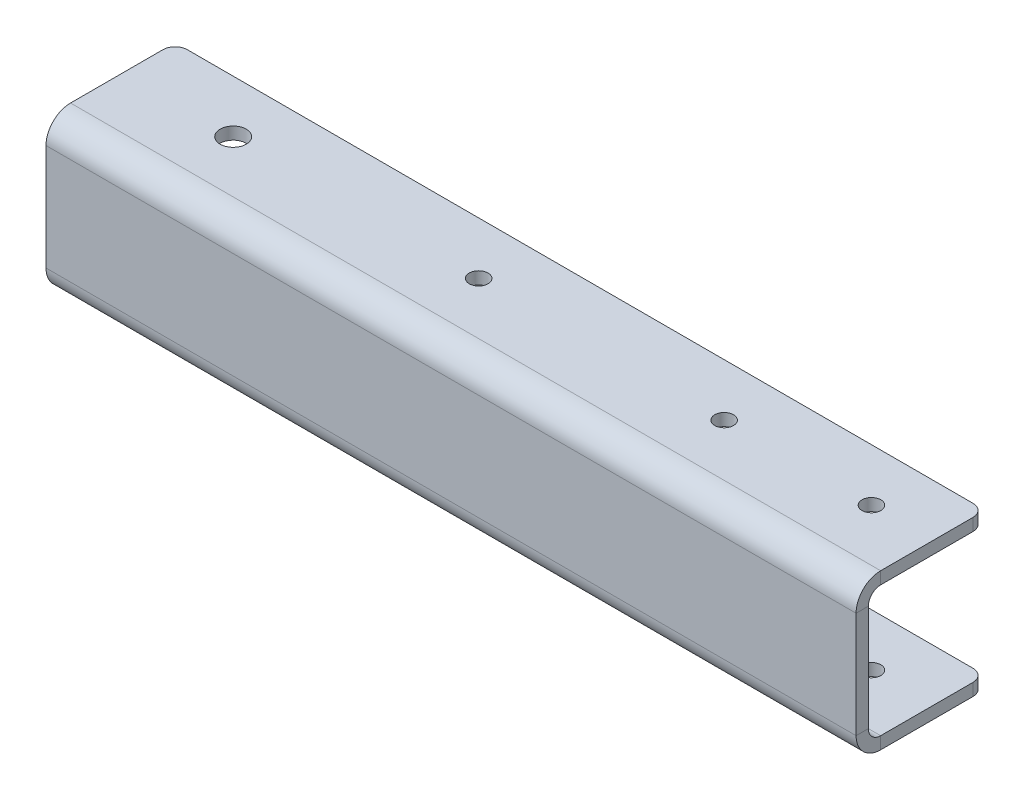
ISO-10303-21;
HEADER;
FILE_DESCRIPTION(('STEP AP214'),'2;1');
FILE_NAME('part.step','',(''),(''),'','','');
FILE_SCHEMA(('AUTOMOTIVE_DESIGN { 1 0 10303 214 1 1 1 1 }'));
ENDSEC;
DATA;
#1=APPLICATION_CONTEXT('core data for automotive mechanical design processes');
#2=APPLICATION_PROTOCOL_DEFINITION('international standard','automotive_design',2000,#1);
#3=PRODUCT_CONTEXT('',#1,'mechanical');
#4=PRODUCT('Part','Part','',(#3));
#5=PRODUCT_RELATED_PRODUCT_CATEGORY('part','',(#4));
#6=PRODUCT_DEFINITION_FORMATION('','',#4);
#7=PRODUCT_DEFINITION_CONTEXT('part definition',#1,'design');
#8=PRODUCT_DEFINITION('design','',#6,#7);
#9=PRODUCT_DEFINITION_SHAPE('','',#8);
#10=(LENGTH_UNIT() NAMED_UNIT(*) SI_UNIT(.MILLI.,.METRE.));
#11=(NAMED_UNIT(*) PLANE_ANGLE_UNIT() SI_UNIT($,.RADIAN.));
#12=(NAMED_UNIT(*) SI_UNIT($,.STERADIAN.) SOLID_ANGLE_UNIT());
#13=UNCERTAINTY_MEASURE_WITH_UNIT(LENGTH_MEASURE(1.E-05),#10,'distance_accuracy_value','');
#14=(GEOMETRIC_REPRESENTATION_CONTEXT(3) GLOBAL_UNCERTAINTY_ASSIGNED_CONTEXT((#13)) GLOBAL_UNIT_ASSIGNED_CONTEXT((#10,
#11,#12)) REPRESENTATION_CONTEXT('',''));
#15=CARTESIAN_POINT('',(0.,0.,0.));
#16=DIRECTION('',(0.,0.,1.));
#17=DIRECTION('',(1.,0.,0.));
#18=AXIS2_PLACEMENT_3D('',#15,#16,#17);
#19=CARTESIAN_POINT('',(209.55,0.,-3.175));
#20=DIRECTION('',(1.,0.,0.));
#21=DIRECTION('',(0.,0.,-1.));
#22=AXIS2_PLACEMENT_3D('',#19,#20,#21);
#23=PLANE('',#22);
#24=DIRECTION('',(0.,-1.,0.));
#25=VECTOR('',#24,1.);
#26=CARTESIAN_POINT('',(209.55,0.,-3.175));
#27=LINE('',#26,#25);
#28=CARTESIAN_POINT('',(209.55,0.,-3.175));
#29=VERTEX_POINT('',#28);
#30=CARTESIAN_POINT('',(209.55,-3.175,-3.175));
#31=VERTEX_POINT('',#30);
#32=EDGE_CURVE('E272',#29,#31,#27,.T.);
#33=ORIENTED_EDGE('',*,*,#32,.F.);
#34=CARTESIAN_POINT('',(209.55,3.175,-3.175));
#35=DIRECTION('',(1.,0.,0.));
#36=DIRECTION('',(0.,0.,-1.));
#37=AXIS2_PLACEMENT_3D('',#34,#35,#36);
#38=CIRCLE('',#37,3.175);
#39=CARTESIAN_POINT('',(209.55,3.175,0.));
#40=VERTEX_POINT('',#39);
#41=EDGE_CURVE('E201',#29,#40,#38,.F.);
#42=ORIENTED_EDGE('',*,*,#41,.T.);
#43=DIRECTION('',(0.,0.,-1.));
#44=VECTOR('',#43,1.);
#45=CARTESIAN_POINT('',(209.55,3.175,3.175));
#46=LINE('',#45,#44);
#47=CARTESIAN_POINT('',(209.55,3.175,3.175));
#48=VERTEX_POINT('',#47);
#49=EDGE_CURVE('E270',#48,#40,#46,.T.);
#50=ORIENTED_EDGE('',*,*,#49,.F.);
#51=CARTESIAN_POINT('',(209.55,3.175,-3.175));
#52=DIRECTION('',(1.,0.,0.));
#53=DIRECTION('',(0.,0.,-1.));
#54=AXIS2_PLACEMENT_3D('',#51,#52,#53);
#55=CIRCLE('',#54,6.35);
#56=EDGE_CURVE('E191',#31,#48,#55,.F.);
#57=ORIENTED_EDGE('',*,*,#56,.F.);
#58=EDGE_LOOP('',(#33,#42,#50,#57));
#59=FACE_BOUND('',#58,.T.);
#60=ADVANCED_FACE('F36',(#59),#23,.T.);
#61=CARTESIAN_POINT('',(209.55,3.175,3.175));
#62=DIRECTION('',(1.,0.,0.));
#63=DIRECTION('',(0.,0.,-1.));
#64=AXIS2_PLACEMENT_3D('',#61,#62,#63);
#65=PLANE('',#64);
#66=DIRECTION('',(0.,0.,-1.));
#67=VECTOR('',#66,1.);
#68=CARTESIAN_POINT('',(209.55,-3.175,0.));
#69=LINE('',#68,#67);
#70=CARTESIAN_POINT('',(209.55,-3.175,-27.051));
#71=VERTEX_POINT('',#70);
#72=EDGE_CURVE('E197',#71,#31,#69,.F.);
#73=ORIENTED_EDGE('',*,*,#72,.F.);
#74=DIRECTION('',(0.,-1.,0.));
#75=VECTOR('',#74,1.);
#76=CARTESIAN_POINT('',(209.55,3.175,-27.051));
#77=LINE('',#76,#75);
#78=CARTESIAN_POINT('',(209.55,0.,-27.051));
#79=VERTEX_POINT('',#78);
#80=EDGE_CURVE('E44',#71,#79,#77,.F.);
#81=ORIENTED_EDGE('',*,*,#80,.T.);
#82=DIRECTION('',(0.,0.,1.));
#83=VECTOR('',#82,1.);
#84=CARTESIAN_POINT('',(209.55,0.,0.));
#85=LINE('',#84,#83);
#86=EDGE_CURVE('E199',#79,#29,#85,.T.);
#87=ORIENTED_EDGE('',*,*,#86,.T.);
#88=ORIENTED_EDGE('',*,*,#32,.T.);
#89=EDGE_LOOP('',(#73,#81,#87,#88));
#90=FACE_BOUND('',#89,.T.);
#91=ADVANCED_FACE('F341',(#90),#65,.T.);
#92=CARTESIAN_POINT('',(0.,3.175,0.));
#93=DIRECTION('',(-1.,0.,0.));
#94=DIRECTION('',(0.,0.,1.));
#95=AXIS2_PLACEMENT_3D('',#92,#93,#94);
#96=PLANE('',#95);
#97=DIRECTION('',(0.,0.,1.));
#98=VECTOR('',#97,1.);
#99=CARTESIAN_POINT('',(0.,3.175,0.));
#100=LINE('',#99,#98);
#101=CARTESIAN_POINT('',(0.,3.175,0.));
#102=VERTEX_POINT('',#101);
#103=CARTESIAN_POINT('',(0.,3.175,3.175));
#104=VERTEX_POINT('',#103);
#105=EDGE_CURVE('E268',#102,#104,#100,.T.);
#106=ORIENTED_EDGE('',*,*,#105,.F.);
#107=CARTESIAN_POINT('',(0.,3.175,-3.175));
#108=DIRECTION('',(1.,0.,0.));
#109=DIRECTION('',(0.,0.,-1.));
#110=AXIS2_PLACEMENT_3D('',#107,#108,#109);
#111=CIRCLE('',#110,3.175);
#112=CARTESIAN_POINT('',(0.,0.,-3.175));
#113=VERTEX_POINT('',#112);
#114=EDGE_CURVE('E226',#113,#102,#111,.F.);
#115=ORIENTED_EDGE('',*,*,#114,.F.);
#116=DIRECTION('',(0.,1.,0.));
#117=VECTOR('',#116,1.);
#118=CARTESIAN_POINT('',(0.,-3.175,-3.175));
#119=LINE('',#118,#117);
#120=CARTESIAN_POINT('',(0.,-3.175,-3.175));
#121=VERTEX_POINT('',#120);
#122=EDGE_CURVE('E265',#121,#113,#119,.T.);
#123=ORIENTED_EDGE('',*,*,#122,.F.);
#124=CARTESIAN_POINT('',(0.,3.175,-3.175));
#125=DIRECTION('',(1.,0.,0.));
#126=DIRECTION('',(0.,0.,-1.));
#127=AXIS2_PLACEMENT_3D('',#124,#125,#126);
#128=CIRCLE('',#127,6.35);
#129=EDGE_CURVE('E219',#121,#104,#128,.F.);
#130=ORIENTED_EDGE('',*,*,#129,.T.);
#131=EDGE_LOOP('',(#106,#115,#123,#130));
#132=FACE_BOUND('',#131,.T.);
#133=ADVANCED_FACE('F447',(#132),#96,.T.);
#134=CARTESIAN_POINT('',(0.,-3.175,-3.175));
#135=DIRECTION('',(-1.,0.,0.));
#136=DIRECTION('',(0.,0.,1.));
#137=AXIS2_PLACEMENT_3D('',#134,#135,#136);
#138=PLANE('',#137);
#139=DIRECTION('',(0.,1.,0.));
#140=VECTOR('',#139,1.);
#141=CARTESIAN_POINT('',(0.,0.,0.));
#142=LINE('',#141,#140);
#143=CARTESIAN_POINT('',(0.,30.607,0.));
#144=VERTEX_POINT('',#143);
#145=EDGE_CURVE('E229',#102,#144,#142,.T.);
#146=ORIENTED_EDGE('',*,*,#145,.F.);
#147=ORIENTED_EDGE('',*,*,#105,.T.);
#148=DIRECTION('',(0.,1.,0.));
#149=VECTOR('',#148,1.);
#150=CARTESIAN_POINT('',(0.,0.,3.175));
#151=LINE('',#150,#149);
#152=CARTESIAN_POINT('',(0.,30.607,3.175));
#153=VERTEX_POINT('',#152);
#154=EDGE_CURVE('E216',#104,#153,#151,.T.);
#155=ORIENTED_EDGE('',*,*,#154,.T.);
#156=DIRECTION('',(0.,0.,-1.));
#157=VECTOR('',#156,1.);
#158=CARTESIAN_POINT('',(0.,30.607,3.175));
#159=LINE('',#158,#157);
#160=EDGE_CURVE('E261',#153,#144,#159,.T.);
#161=ORIENTED_EDGE('',*,*,#160,.T.);
#162=EDGE_LOOP('',(#146,#147,#155,#161));
#163=FACE_BOUND('',#162,.T.);
#164=ADVANCED_FACE('F475',(#163),#138,.T.);
#165=CARTESIAN_POINT('',(209.55,30.607,0.));
#166=DIRECTION('',(1.,0.,0.));
#167=DIRECTION('',(0.,0.,-1.));
#168=AXIS2_PLACEMENT_3D('',#165,#166,#167);
#169=PLANE('',#168);
#170=DIRECTION('',(0.,0.,1.));
#171=VECTOR('',#170,1.);
#172=CARTESIAN_POINT('',(209.55,30.607,0.));
#173=LINE('',#172,#171);
#174=CARTESIAN_POINT('',(209.55,30.607,0.));
#175=VERTEX_POINT('',#174);
#176=CARTESIAN_POINT('',(209.55,30.607,3.175));
#177=VERTEX_POINT('',#176);
#178=EDGE_CURVE('E162',#175,#177,#173,.T.);
#179=ORIENTED_EDGE('',*,*,#178,.F.);
#180=CARTESIAN_POINT('',(209.55,30.607,-3.175));
#181=DIRECTION('',(1.,0.,0.));
#182=DIRECTION('',(0.,0.,-1.));
#183=AXIS2_PLACEMENT_3D('',#180,#181,#182);
#184=CIRCLE('',#183,3.175);
#185=CARTESIAN_POINT('',(209.55,33.782,-3.175));
#186=VERTEX_POINT('',#185);
#187=EDGE_CURVE('E157',#175,#186,#184,.F.);
#188=ORIENTED_EDGE('',*,*,#187,.T.);
#189=DIRECTION('',(0.,-1.,0.));
#190=VECTOR('',#189,1.);
#191=CARTESIAN_POINT('',(209.55,36.957,-3.175));
#192=LINE('',#191,#190);
#193=CARTESIAN_POINT('',(209.55,36.957,-3.175));
#194=VERTEX_POINT('',#193);
#195=EDGE_CURVE('E150',#194,#186,#192,.T.);
#196=ORIENTED_EDGE('',*,*,#195,.F.);
#197=CARTESIAN_POINT('',(209.55,30.607,-3.175));
#198=DIRECTION('',(1.,0.,0.));
#199=DIRECTION('',(0.,0.,-1.));
#200=AXIS2_PLACEMENT_3D('',#197,#198,#199);
#201=CIRCLE('',#200,6.35);
#202=EDGE_CURVE('E154',#177,#194,#201,.F.);
#203=ORIENTED_EDGE('',*,*,#202,.F.);
#204=EDGE_LOOP('',(#179,#188,#196,#203));
#205=FACE_BOUND('',#204,.T.);
#206=ADVANCED_FACE('F152',(#205),#169,.T.);
#207=CARTESIAN_POINT('',(209.55,36.957,-3.175));
#208=DIRECTION('',(1.,0.,0.));
#209=DIRECTION('',(0.,0.,-1.));
#210=AXIS2_PLACEMENT_3D('',#207,#208,#209);
#211=PLANE('',#210);
#212=DIRECTION('',(0.,1.,0.));
#213=VECTOR('',#212,1.);
#214=CARTESIAN_POINT('',(209.55,0.,0.));
#215=LINE('',#214,#213);
#216=EDGE_CURVE('E204',#40,#175,#215,.T.);
#217=ORIENTED_EDGE('',*,*,#216,.T.);
#218=ORIENTED_EDGE('',*,*,#178,.T.);
#219=DIRECTION('',(0.,1.,0.));
#220=VECTOR('',#219,1.);
#221=CARTESIAN_POINT('',(209.55,0.,3.175));
#222=LINE('',#221,#220);
#223=EDGE_CURVE('E189',#48,#177,#222,.T.);
#224=ORIENTED_EDGE('',*,*,#223,.F.);
#225=ORIENTED_EDGE('',*,*,#49,.T.);
#226=EDGE_LOOP('',(#217,#218,#224,#225));
#227=FACE_BOUND('',#226,.T.);
#228=ADVANCED_FACE('F357',(#227),#211,.T.);
#229=CARTESIAN_POINT('',(0.,33.782,-3.175));
#230=DIRECTION('',(-1.,0.,0.));
#231=DIRECTION('',(0.,0.,1.));
#232=AXIS2_PLACEMENT_3D('',#229,#230,#231);
#233=PLANE('',#232);
#234=DIRECTION('',(0.,1.,0.));
#235=VECTOR('',#234,1.);
#236=CARTESIAN_POINT('',(0.,33.782,-3.175));
#237=LINE('',#236,#235);
#238=CARTESIAN_POINT('',(0.,33.782,-3.175));
#239=VERTEX_POINT('',#238);
#240=CARTESIAN_POINT('',(0.,36.957,-3.175));
#241=VERTEX_POINT('',#240);
#242=EDGE_CURVE('E163',#239,#241,#237,.T.);
#243=ORIENTED_EDGE('',*,*,#242,.F.);
#244=CARTESIAN_POINT('',(0.,30.607,-3.175));
#245=DIRECTION('',(1.,0.,0.));
#246=DIRECTION('',(0.,0.,-1.));
#247=AXIS2_PLACEMENT_3D('',#244,#245,#246);
#248=CIRCLE('',#247,3.175);
#249=EDGE_CURVE('E232',#144,#239,#248,.F.);
#250=ORIENTED_EDGE('',*,*,#249,.F.);
#251=ORIENTED_EDGE('',*,*,#160,.F.);
#252=CARTESIAN_POINT('',(0.,30.607,-3.175));
#253=DIRECTION('',(1.,0.,0.));
#254=DIRECTION('',(0.,0.,-1.));
#255=AXIS2_PLACEMENT_3D('',#252,#253,#254);
#256=CIRCLE('',#255,6.35);
#257=EDGE_CURVE('E214',#153,#241,#256,.F.);
#258=ORIENTED_EDGE('',*,*,#257,.T.);
#259=EDGE_LOOP('',(#243,#250,#251,#258));
#260=FACE_BOUND('',#259,.T.);
#261=ADVANCED_FACE('F473',(#260),#233,.T.);
#262=CARTESIAN_POINT('',(0.,30.607,3.175));
#263=DIRECTION('',(-1.,0.,0.));
#264=DIRECTION('',(0.,0.,1.));
#265=AXIS2_PLACEMENT_3D('',#262,#263,#264);
#266=PLANE('',#265);
#267=DIRECTION('',(0.,0.,-1.));
#268=VECTOR('',#267,1.);
#269=CARTESIAN_POINT('',(0.,36.957,0.));
#270=LINE('',#269,#268);
#271=CARTESIAN_POINT('',(0.,36.957,-27.051));
#272=VERTEX_POINT('',#271);
#273=EDGE_CURVE('E175',#241,#272,#270,.T.);
#274=ORIENTED_EDGE('',*,*,#273,.T.);
#275=DIRECTION('',(0.,-1.,0.));
#276=VECTOR('',#275,1.);
#277=CARTESIAN_POINT('',(0.,30.607,-27.051));
#278=LINE('',#277,#276);
#279=CARTESIAN_POINT('',(0.,33.782,-27.051));
#280=VERTEX_POINT('',#279);
#281=EDGE_CURVE('E275',#272,#280,#278,.T.);
#282=ORIENTED_EDGE('',*,*,#281,.T.);
#283=DIRECTION('',(0.,0.,-1.));
#284=VECTOR('',#283,1.);
#285=CARTESIAN_POINT('',(0.,33.782,0.));
#286=LINE('',#285,#284);
#287=EDGE_CURVE('E209',#239,#280,#286,.T.);
#288=ORIENTED_EDGE('',*,*,#287,.F.);
#289=ORIENTED_EDGE('',*,*,#242,.T.);
#290=EDGE_LOOP('',(#274,#282,#288,#289));
#291=FACE_BOUND('',#290,.T.);
#292=ADVANCED_FACE('F471',(#291),#266,.T.);
#293=CARTESIAN_POINT('',(209.55,33.782,0.));
#294=DIRECTION('',(0.,1.,0.));
#295=DIRECTION('',(0.,0.,1.));
#296=AXIS2_PLACEMENT_3D('',#293,#294,#295);
#297=PLANE('',#296);
#298=CARTESIAN_POINT('',(28.575,33.782,-16.66875));
#299=DIRECTION('',(0.,1.,0.));
#300=DIRECTION('',(0.,0.,1.));
#301=AXIS2_PLACEMENT_3D('',#298,#299,#300);
#302=CIRCLE('',#301,3.3782);
#303=CARTESIAN_POINT('',(28.575,33.782,-13.29055));
#304=VERTEX_POINT('',#303);
#305=EDGE_CURVE('E212',#304,#304,#302,.T.);
#306=ORIENTED_EDGE('',*,*,#305,.T.);
#307=EDGE_LOOP('',(#306));
#308=FACE_BOUND('',#307,.T.);
#309=CARTESIAN_POINT('',(92.075,33.782,-16.66875));
#310=DIRECTION('',(0.,1.,0.));
#311=DIRECTION('',(0.,0.,1.));
#312=AXIS2_PLACEMENT_3D('',#309,#310,#311);
#313=CIRCLE('',#312,2.4257);
#314=CARTESIAN_POINT('',(92.075,33.782,-14.24305));
#315=VERTEX_POINT('',#314);
#316=EDGE_CURVE('E288',#315,#315,#313,.T.);
#317=ORIENTED_EDGE('',*,*,#316,.T.);
#318=EDGE_LOOP('',(#317));
#319=FACE_BOUND('',#318,.T.);
#320=CARTESIAN_POINT('',(155.575,33.782,-16.66875));
#321=DIRECTION('',(0.,1.,0.));
#322=DIRECTION('',(0.,0.,1.));
#323=AXIS2_PLACEMENT_3D('',#320,#321,#322);
#324=CIRCLE('',#323,2.4257);
#325=CARTESIAN_POINT('',(155.575,33.782,-14.24305));
#326=VERTEX_POINT('',#325);
#327=EDGE_CURVE('E284',#326,#326,#324,.T.);
#328=ORIENTED_EDGE('',*,*,#327,.T.);
#329=EDGE_LOOP('',(#328));
#330=FACE_BOUND('',#329,.T.);
#331=CARTESIAN_POINT('',(193.675,33.782,-16.66875));
#332=DIRECTION('',(0.,1.,0.));
#333=DIRECTION('',(0.,0.,1.));
#334=AXIS2_PLACEMENT_3D('',#331,#332,#333);
#335=CIRCLE('',#334,2.4257);
#336=CARTESIAN_POINT('',(193.675,33.782,-14.24305));
#337=VERTEX_POINT('',#336);
#338=EDGE_CURVE('E279',#337,#337,#335,.T.);
#339=ORIENTED_EDGE('',*,*,#338,.T.);
#340=EDGE_LOOP('',(#339));
#341=FACE_BOUND('',#340,.T.);
#342=ORIENTED_EDGE('',*,*,#287,.T.);
#343=CARTESIAN_POINT('',(3.175,33.782,-27.051));
#344=DIRECTION('',(0.,1.,0.));
#345=DIRECTION('',(0.,0.,1.));
#346=AXIS2_PLACEMENT_3D('',#343,#344,#345);
#347=CIRCLE('',#346,3.175);
#348=CARTESIAN_POINT('',(3.17500000000001,33.782,-30.226));
#349=VERTEX_POINT('',#348);
#350=EDGE_CURVE('E296',#280,#349,#347,.F.);
#351=ORIENTED_EDGE('',*,*,#350,.T.);
#352=DIRECTION('',(-1.,0.,0.));
#353=VECTOR('',#352,1.);
#354=CARTESIAN_POINT('',(209.55,33.782,-30.226));
#355=LINE('',#354,#353);
#356=CARTESIAN_POINT('',(206.375,33.782,-30.226));
#357=VERTEX_POINT('',#356);
#358=EDGE_CURVE('E258',#357,#349,#355,.T.);
#359=ORIENTED_EDGE('',*,*,#358,.F.);
#360=CARTESIAN_POINT('',(206.375,33.782,-27.051));
#361=DIRECTION('',(0.,1.,0.));
#362=DIRECTION('',(0.,0.,1.));
#363=AXIS2_PLACEMENT_3D('',#360,#361,#362);
#364=CIRCLE('',#363,3.175);
#365=CARTESIAN_POINT('',(209.55,33.782,-27.051));
#366=VERTEX_POINT('',#365);
#367=EDGE_CURVE('E294',#357,#366,#364,.F.);
#368=ORIENTED_EDGE('',*,*,#367,.T.);
#369=DIRECTION('',(0.,0.,-1.));
#370=VECTOR('',#369,1.);
#371=CARTESIAN_POINT('',(209.55,33.782,0.));
#372=LINE('',#371,#370);
#373=EDGE_CURVE('E184',#186,#366,#372,.T.);
#374=ORIENTED_EDGE('',*,*,#373,.F.);
#375=DIRECTION('',(-1.,0.,0.));
#376=VECTOR('',#375,1.);
#377=CARTESIAN_POINT('',(209.55,33.782,-3.175));
#378=LINE('',#377,#376);
#379=EDGE_CURVE('E208',#186,#239,#378,.T.);
#380=ORIENTED_EDGE('',*,*,#379,.T.);
#381=EDGE_LOOP('',(#342,#351,#359,#368,#374,#380));
#382=FACE_BOUND('',#381,.T.);
#383=ADVANCED_FACE('F369',(#308,#319,#330,#341,#382),#297,.F.);
#384=CARTESIAN_POINT('',(209.55,36.957,-30.226));
#385=DIRECTION('',(0.,0.,-1.));
#386=DIRECTION('',(-1.,0.,0.));
#387=AXIS2_PLACEMENT_3D('',#384,#385,#386);
#388=PLANE('',#387);
#389=ORIENTED_EDGE('',*,*,#358,.T.);
#390=DIRECTION('',(0.,-1.,0.));
#391=VECTOR('',#390,1.);
#392=CARTESIAN_POINT('',(3.17500000000001,36.957,-30.226));
#393=LINE('',#392,#391);
#394=CARTESIAN_POINT('',(3.17500000000001,36.957,-30.226));
#395=VERTEX_POINT('',#394);
#396=EDGE_CURVE('E301',#349,#395,#393,.F.);
#397=ORIENTED_EDGE('',*,*,#396,.T.);
#398=DIRECTION('',(-1.,0.,0.));
#399=VECTOR('',#398,1.);
#400=CARTESIAN_POINT('',(209.55,36.957,-30.226));
#401=LINE('',#400,#399);
#402=CARTESIAN_POINT('',(206.375,36.957,-30.226));
#403=VERTEX_POINT('',#402);
#404=EDGE_CURVE('E179',#403,#395,#401,.T.);
#405=ORIENTED_EDGE('',*,*,#404,.F.);
#406=DIRECTION('',(0.,-1.,0.));
#407=VECTOR('',#406,1.);
#408=CARTESIAN_POINT('',(206.375,36.957,-30.226));
#409=LINE('',#408,#407);
#410=EDGE_CURVE('E298',#403,#357,#409,.T.);
#411=ORIENTED_EDGE('',*,*,#410,.T.);
#412=EDGE_LOOP('',(#389,#397,#405,#411));
#413=FACE_BOUND('',#412,.T.);
#414=ADVANCED_FACE('F467',(#413),#388,.T.);
#415=CARTESIAN_POINT('',(209.55,36.957,0.));
#416=DIRECTION('',(0.,1.,0.));
#417=DIRECTION('',(0.,0.,1.));
#418=AXIS2_PLACEMENT_3D('',#415,#416,#417);
#419=PLANE('',#418);
#420=CARTESIAN_POINT('',(28.575,36.957,-16.66875));
#421=DIRECTION('',(0.,1.,0.));
#422=DIRECTION('',(0.,0.,1.));
#423=AXIS2_PLACEMENT_3D('',#420,#421,#422);
#424=CIRCLE('',#423,3.3782);
#425=CARTESIAN_POINT('',(28.575,36.957,-13.29055));
#426=VERTEX_POINT('',#425);
#427=EDGE_CURVE('E398',#426,#426,#424,.T.);
#428=ORIENTED_EDGE('',*,*,#427,.F.);
#429=EDGE_LOOP('',(#428));
#430=FACE_BOUND('',#429,.T.);
#431=CARTESIAN_POINT('',(92.075,36.957,-16.66875));
#432=DIRECTION('',(0.,1.,0.));
#433=DIRECTION('',(0.,0.,1.));
#434=AXIS2_PLACEMENT_3D('',#431,#432,#433);
#435=CIRCLE('',#434,2.4257);
#436=CARTESIAN_POINT('',(92.075,36.957,-14.24305));
#437=VERTEX_POINT('',#436);
#438=EDGE_CURVE('E392',#437,#437,#435,.T.);
#439=ORIENTED_EDGE('',*,*,#438,.F.);
#440=EDGE_LOOP('',(#439));
#441=FACE_BOUND('',#440,.T.);
#442=CARTESIAN_POINT('',(155.575,36.957,-16.66875));
#443=DIRECTION('',(0.,1.,0.));
#444=DIRECTION('',(0.,0.,1.));
#445=AXIS2_PLACEMENT_3D('',#442,#443,#444);
#446=CIRCLE('',#445,2.4257);
#447=CARTESIAN_POINT('',(155.575,36.957,-14.24305));
#448=VERTEX_POINT('',#447);
#449=EDGE_CURVE('E386',#448,#448,#446,.T.);
#450=ORIENTED_EDGE('',*,*,#449,.F.);
#451=EDGE_LOOP('',(#450));
#452=FACE_BOUND('',#451,.T.);
#453=CARTESIAN_POINT('',(193.675,36.957,-16.66875));
#454=DIRECTION('',(0.,1.,0.));
#455=DIRECTION('',(0.,0.,1.));
#456=AXIS2_PLACEMENT_3D('',#453,#454,#455);
#457=CIRCLE('',#456,2.4257);
#458=CARTESIAN_POINT('',(193.675,36.957,-14.24305));
#459=VERTEX_POINT('',#458);
#460=EDGE_CURVE('E380',#459,#459,#457,.T.);
#461=ORIENTED_EDGE('',*,*,#460,.F.);
#462=EDGE_LOOP('',(#461));
#463=FACE_BOUND('',#462,.T.);
#464=ORIENTED_EDGE('',*,*,#404,.T.);
#465=CARTESIAN_POINT('',(3.175,36.957,-27.051));
#466=DIRECTION('',(0.,1.,0.));
#467=DIRECTION('',(0.,0.,1.));
#468=AXIS2_PLACEMENT_3D('',#465,#466,#467);
#469=CIRCLE('',#468,3.175);
#470=EDGE_CURVE('E305',#395,#272,#469,.T.);
#471=ORIENTED_EDGE('',*,*,#470,.T.);
#472=ORIENTED_EDGE('',*,*,#273,.F.);
#473=DIRECTION('',(-1.,0.,0.));
#474=VECTOR('',#473,1.);
#475=CARTESIAN_POINT('',(209.55,36.957,-3.175));
#476=LINE('',#475,#474);
#477=EDGE_CURVE('E169',#194,#241,#476,.T.);
#478=ORIENTED_EDGE('',*,*,#477,.F.);
#479=DIRECTION('',(0.,0.,-1.));
#480=VECTOR('',#479,1.);
#481=CARTESIAN_POINT('',(209.55,36.957,0.));
#482=LINE('',#481,#480);
#483=CARTESIAN_POINT('',(209.55,36.957,-27.051));
#484=VERTEX_POINT('',#483);
#485=EDGE_CURVE('E172',#194,#484,#482,.T.);
#486=ORIENTED_EDGE('',*,*,#485,.T.);
#487=CARTESIAN_POINT('',(206.375,36.957,-27.051));
#488=DIRECTION('',(0.,1.,0.));
#489=DIRECTION('',(0.,0.,1.));
#490=AXIS2_PLACEMENT_3D('',#487,#488,#489);
#491=CIRCLE('',#490,3.175);
#492=EDGE_CURVE('E303',#484,#403,#491,.T.);
#493=ORIENTED_EDGE('',*,*,#492,.T.);
#494=EDGE_LOOP('',(#464,#471,#472,#478,#486,#493));
#495=FACE_BOUND('',#494,.T.);
#496=ADVANCED_FACE('F171',(#430,#441,#452,#463,#495),#419,.T.);
#497=CARTESIAN_POINT('',(209.55,30.607,-3.175));
#498=DIRECTION('',(-1.,0.,0.));
#499=DIRECTION('',(0.,0.,1.));
#500=AXIS2_PLACEMENT_3D('',#497,#498,#499);
#501=CYLINDRICAL_SURFACE('',#500,6.35);
#502=ORIENTED_EDGE('',*,*,#257,.F.);
#503=DIRECTION('',(-1.,0.,0.));
#504=VECTOR('',#503,1.);
#505=CARTESIAN_POINT('',(209.55,30.607,3.175));
#506=LINE('',#505,#504);
#507=EDGE_CURVE('E180',#177,#153,#506,.T.);
#508=ORIENTED_EDGE('',*,*,#507,.F.);
#509=ORIENTED_EDGE('',*,*,#202,.T.);
#510=ORIENTED_EDGE('',*,*,#477,.T.);
#511=EDGE_LOOP('',(#502,#508,#509,#510));
#512=FACE_BOUND('',#511,.T.);
#513=ADVANCED_FACE('F187',(#512),#501,.T.);
#514=CARTESIAN_POINT('',(209.55,0.,3.175));
#515=DIRECTION('',(0.,0.,1.));
#516=DIRECTION('',(1.,0.,0.));
#517=AXIS2_PLACEMENT_3D('',#514,#515,#516);
#518=PLANE('',#517);
#519=ORIENTED_EDGE('',*,*,#154,.F.);
#520=DIRECTION('',(-1.,0.,0.));
#521=VECTOR('',#520,1.);
#522=CARTESIAN_POINT('',(209.55,3.175,3.175));
#523=LINE('',#522,#521);
#524=EDGE_CURVE('E253',#48,#104,#523,.T.);
#525=ORIENTED_EDGE('',*,*,#524,.F.);
#526=ORIENTED_EDGE('',*,*,#223,.T.);
#527=ORIENTED_EDGE('',*,*,#507,.T.);
#528=EDGE_LOOP('',(#519,#525,#526,#527));
#529=FACE_BOUND('',#528,.T.);
#530=ADVANCED_FACE('F356',(#529),#518,.T.);
#531=CARTESIAN_POINT('',(209.55,3.175,-3.175));
#532=DIRECTION('',(-1.,0.,0.));
#533=DIRECTION('',(0.,0.,1.));
#534=AXIS2_PLACEMENT_3D('',#531,#532,#533);
#535=CYLINDRICAL_SURFACE('',#534,6.35);
#536=ORIENTED_EDGE('',*,*,#129,.F.);
#537=DIRECTION('',(-1.,0.,0.));
#538=VECTOR('',#537,1.);
#539=CARTESIAN_POINT('',(209.55,-3.175,-3.175));
#540=LINE('',#539,#538);
#541=EDGE_CURVE('E250',#31,#121,#540,.T.);
#542=ORIENTED_EDGE('',*,*,#541,.F.);
#543=ORIENTED_EDGE('',*,*,#56,.T.);
#544=ORIENTED_EDGE('',*,*,#524,.T.);
#545=EDGE_LOOP('',(#536,#542,#543,#544));
#546=FACE_BOUND('',#545,.T.);
#547=ADVANCED_FACE('F348',(#546),#535,.T.);
#548=CARTESIAN_POINT('',(209.55,-3.175,0.));
#549=DIRECTION('',(0.,-1.,0.));
#550=DIRECTION('',(0.,0.,-1.));
#551=AXIS2_PLACEMENT_3D('',#548,#549,#550);
#552=PLANE('',#551);
#553=CARTESIAN_POINT('',(28.575,-3.175,-16.66875));
#554=DIRECTION('',(0.,1.,0.));
#555=DIRECTION('',(0.,0.,1.));
#556=AXIS2_PLACEMENT_3D('',#553,#554,#555);
#557=CIRCLE('',#556,3.3782);
#558=CARTESIAN_POINT('',(28.575,-3.175,-13.29055));
#559=VERTEX_POINT('',#558);
#560=EDGE_CURVE('E280',#559,#559,#557,.T.);
#561=ORIENTED_EDGE('',*,*,#560,.T.);
#562=EDGE_LOOP('',(#561));
#563=FACE_BOUND('',#562,.T.);
#564=CARTESIAN_POINT('',(92.075,-3.175,-16.66875));
#565=DIRECTION('',(0.,1.,0.));
#566=DIRECTION('',(0.,0.,1.));
#567=AXIS2_PLACEMENT_3D('',#564,#565,#566);
#568=CIRCLE('',#567,2.4257);
#569=CARTESIAN_POINT('',(92.075,-3.175,-14.24305));
#570=VERTEX_POINT('',#569);
#571=EDGE_CURVE('E395',#570,#570,#568,.T.);
#572=ORIENTED_EDGE('',*,*,#571,.T.);
#573=EDGE_LOOP('',(#572));
#574=FACE_BOUND('',#573,.T.);
#575=CARTESIAN_POINT('',(155.575,-3.175,-16.66875));
#576=DIRECTION('',(0.,1.,0.));
#577=DIRECTION('',(0.,0.,1.));
#578=AXIS2_PLACEMENT_3D('',#575,#576,#577);
#579=CIRCLE('',#578,2.4257);
#580=CARTESIAN_POINT('',(155.575,-3.175,-14.24305));
#581=VERTEX_POINT('',#580);
#582=EDGE_CURVE('E389',#581,#581,#579,.T.);
#583=ORIENTED_EDGE('',*,*,#582,.T.);
#584=EDGE_LOOP('',(#583));
#585=FACE_BOUND('',#584,.T.);
#586=CARTESIAN_POINT('',(193.675,-3.175,-16.66875));
#587=DIRECTION('',(0.,1.,0.));
#588=DIRECTION('',(0.,0.,1.));
#589=AXIS2_PLACEMENT_3D('',#586,#587,#588);
#590=CIRCLE('',#589,2.4257);
#591=CARTESIAN_POINT('',(193.675,-3.175,-14.24305));
#592=VERTEX_POINT('',#591);
#593=EDGE_CURVE('E383',#592,#592,#590,.T.);
#594=ORIENTED_EDGE('',*,*,#593,.T.);
#595=EDGE_LOOP('',(#594));
#596=FACE_BOUND('',#595,.T.);
#597=DIRECTION('',(0.,0.,-1.));
#598=VECTOR('',#597,1.);
#599=CARTESIAN_POINT('',(0.,-3.175,0.));
#600=LINE('',#599,#598);
#601=CARTESIAN_POINT('',(0.,-3.175,-27.051));
#602=VERTEX_POINT('',#601);
#603=EDGE_CURVE('E222',#602,#121,#600,.F.);
#604=ORIENTED_EDGE('',*,*,#603,.F.);
#605=CARTESIAN_POINT('',(3.175,-3.175,-27.051));
#606=DIRECTION('',(0.,-1.,0.));
#607=DIRECTION('',(0.,0.,-1.));
#608=AXIS2_PLACEMENT_3D('',#605,#606,#607);
#609=CIRCLE('',#608,3.175);
#610=CARTESIAN_POINT('',(3.17500000000001,-3.175,-30.226));
#611=VERTEX_POINT('',#610);
#612=EDGE_CURVE('E312',#602,#611,#609,.T.);
#613=ORIENTED_EDGE('',*,*,#612,.T.);
#614=DIRECTION('',(-1.,0.,0.));
#615=VECTOR('',#614,1.);
#616=CARTESIAN_POINT('',(209.55,-3.175,-30.226));
#617=LINE('',#616,#615);
#618=CARTESIAN_POINT('',(206.375,-3.175,-30.226));
#619=VERTEX_POINT('',#618);
#620=EDGE_CURVE('E248',#619,#611,#617,.T.);
#621=ORIENTED_EDGE('',*,*,#620,.F.);
#622=CARTESIAN_POINT('',(206.375,-3.175,-27.051));
#623=DIRECTION('',(0.,-1.,0.));
#624=DIRECTION('',(0.,0.,-1.));
#625=AXIS2_PLACEMENT_3D('',#622,#623,#624);
#626=CIRCLE('',#625,3.175);
#627=EDGE_CURVE('E310',#619,#71,#626,.T.);
#628=ORIENTED_EDGE('',*,*,#627,.T.);
#629=ORIENTED_EDGE('',*,*,#72,.T.);
#630=ORIENTED_EDGE('',*,*,#541,.T.);
#631=EDGE_LOOP('',(#604,#613,#621,#628,#629,#630));
#632=FACE_BOUND('',#631,.T.);
#633=ADVANCED_FACE('F335',(#563,#574,#585,#596,#632),#552,.T.);
#634=CARTESIAN_POINT('',(209.55,0.,-30.226));
#635=DIRECTION('',(0.,0.,-1.));
#636=DIRECTION('',(-1.,0.,0.));
#637=AXIS2_PLACEMENT_3D('',#634,#635,#636);
#638=PLANE('',#637);
#639=ORIENTED_EDGE('',*,*,#620,.T.);
#640=DIRECTION('',(0.,-1.,0.));
#641=VECTOR('',#640,1.);
#642=CARTESIAN_POINT('',(3.175,0.,-30.226));
#643=LINE('',#642,#641);
#644=CARTESIAN_POINT('',(3.17500000000001,0.,-30.226));
#645=VERTEX_POINT('',#644);
#646=EDGE_CURVE('E58',#611,#645,#643,.F.);
#647=ORIENTED_EDGE('',*,*,#646,.T.);
#648=DIRECTION('',(-1.,0.,0.));
#649=VECTOR('',#648,1.);
#650=CARTESIAN_POINT('',(209.55,0.,-30.226));
#651=LINE('',#650,#649);
#652=CARTESIAN_POINT('',(206.375,0.,-30.226));
#653=VERTEX_POINT('',#652);
#654=EDGE_CURVE('E246',#653,#645,#651,.T.);
#655=ORIENTED_EDGE('',*,*,#654,.F.);
#656=DIRECTION('',(0.,-1.,0.));
#657=VECTOR('',#656,1.);
#658=CARTESIAN_POINT('',(206.375,0.,-30.226));
#659=LINE('',#658,#657);
#660=EDGE_CURVE('E314',#653,#619,#659,.T.);
#661=ORIENTED_EDGE('',*,*,#660,.T.);
#662=EDGE_LOOP('',(#639,#647,#655,#661));
#663=FACE_BOUND('',#662,.T.);
#664=ADVANCED_FACE('F336',(#663),#638,.T.);
#665=CARTESIAN_POINT('',(209.55,0.,0.));
#666=DIRECTION('',(0.,-1.,0.));
#667=DIRECTION('',(0.,0.,-1.));
#668=AXIS2_PLACEMENT_3D('',#665,#666,#667);
#669=PLANE('',#668);
#670=CARTESIAN_POINT('',(28.575,0.,-16.66875));
#671=DIRECTION('',(0.,-1.,0.));
#672=DIRECTION('',(0.,0.,-1.));
#673=AXIS2_PLACEMENT_3D('',#670,#671,#672);
#674=CIRCLE('',#673,3.3782);
#675=CARTESIAN_POINT('',(28.575,0.,-20.04695));
#676=VERTEX_POINT('',#675);
#677=EDGE_CURVE('E289',#676,#676,#674,.T.);
#678=ORIENTED_EDGE('',*,*,#677,.T.);
#679=EDGE_LOOP('',(#678));
#680=FACE_BOUND('',#679,.T.);
#681=CARTESIAN_POINT('',(92.075,0.,-16.66875));
#682=DIRECTION('',(0.,-1.,0.));
#683=DIRECTION('',(0.,0.,-1.));
#684=AXIS2_PLACEMENT_3D('',#681,#682,#683);
#685=CIRCLE('',#684,2.4257);
#686=CARTESIAN_POINT('',(92.075,0.,-19.09445));
#687=VERTEX_POINT('',#686);
#688=EDGE_CURVE('E285',#687,#687,#685,.T.);
#689=ORIENTED_EDGE('',*,*,#688,.T.);
#690=EDGE_LOOP('',(#689));
#691=FACE_BOUND('',#690,.T.);
#692=CARTESIAN_POINT('',(155.575,0.,-16.66875));
#693=DIRECTION('',(0.,-1.,0.));
#694=DIRECTION('',(0.,0.,-1.));
#695=AXIS2_PLACEMENT_3D('',#692,#693,#694);
#696=CIRCLE('',#695,2.4257);
#697=CARTESIAN_POINT('',(155.575,0.,-19.09445));
#698=VERTEX_POINT('',#697);
#699=EDGE_CURVE('E281',#698,#698,#696,.T.);
#700=ORIENTED_EDGE('',*,*,#699,.T.);
#701=EDGE_LOOP('',(#700));
#702=FACE_BOUND('',#701,.T.);
#703=CARTESIAN_POINT('',(193.675,0.,-16.66875));
#704=DIRECTION('',(0.,-1.,0.));
#705=DIRECTION('',(0.,0.,-1.));
#706=AXIS2_PLACEMENT_3D('',#703,#704,#705);
#707=CIRCLE('',#706,2.4257);
#708=CARTESIAN_POINT('',(193.675,0.,-19.09445));
#709=VERTEX_POINT('',#708);
#710=EDGE_CURVE('E276',#709,#709,#707,.T.);
#711=ORIENTED_EDGE('',*,*,#710,.T.);
#712=EDGE_LOOP('',(#711));
#713=FACE_BOUND('',#712,.T.);
#714=ORIENTED_EDGE('',*,*,#654,.T.);
#715=CARTESIAN_POINT('',(3.175,0.,-27.051));
#716=DIRECTION('',(0.,-1.,0.));
#717=DIRECTION('',(0.,0.,-1.));
#718=AXIS2_PLACEMENT_3D('',#715,#716,#717);
#719=CIRCLE('',#718,3.175);
#720=CARTESIAN_POINT('',(0.,0.,-27.051));
#721=VERTEX_POINT('',#720);
#722=EDGE_CURVE('E320',#645,#721,#719,.F.);
#723=ORIENTED_EDGE('',*,*,#722,.T.);
#724=DIRECTION('',(0.,0.,1.));
#725=VECTOR('',#724,1.);
#726=CARTESIAN_POINT('',(0.,0.,0.));
#727=LINE('',#726,#725);
#728=EDGE_CURVE('E224',#721,#113,#727,.T.);
#729=ORIENTED_EDGE('',*,*,#728,.T.);
#730=DIRECTION('',(-1.,0.,0.));
#731=VECTOR('',#730,1.);
#732=CARTESIAN_POINT('',(209.55,0.,-3.175));
#733=LINE('',#732,#731);
#734=EDGE_CURVE('E243',#29,#113,#733,.T.);
#735=ORIENTED_EDGE('',*,*,#734,.F.);
#736=ORIENTED_EDGE('',*,*,#86,.F.);
#737=CARTESIAN_POINT('',(206.375,0.,-27.051));
#738=DIRECTION('',(0.,-1.,0.));
#739=DIRECTION('',(0.,0.,-1.));
#740=AXIS2_PLACEMENT_3D('',#737,#738,#739);
#741=CIRCLE('',#740,3.175);
#742=EDGE_CURVE('E318',#79,#653,#741,.F.);
#743=ORIENTED_EDGE('',*,*,#742,.T.);
#744=EDGE_LOOP('',(#714,#723,#729,#735,#736,#743));
#745=FACE_BOUND('',#744,.T.);
#746=ADVANCED_FACE('F324',(#680,#691,#702,#713,#745),#669,.F.);
#747=CARTESIAN_POINT('',(209.55,3.175,-3.175));
#748=DIRECTION('',(-1.,0.,0.));
#749=DIRECTION('',(0.,0.,1.));
#750=AXIS2_PLACEMENT_3D('',#747,#748,#749);
#751=CYLINDRICAL_SURFACE('',#750,3.175);
#752=ORIENTED_EDGE('',*,*,#114,.T.);
#753=DIRECTION('',(-1.,0.,0.));
#754=VECTOR('',#753,1.);
#755=CARTESIAN_POINT('',(209.55,3.175,0.));
#756=LINE('',#755,#754);
#757=EDGE_CURVE('E240',#40,#102,#756,.T.);
#758=ORIENTED_EDGE('',*,*,#757,.F.);
#759=ORIENTED_EDGE('',*,*,#41,.F.);
#760=ORIENTED_EDGE('',*,*,#734,.T.);
#761=EDGE_LOOP('',(#752,#758,#759,#760));
#762=FACE_BOUND('',#761,.T.);
#763=ADVANCED_FACE('F417',(#762),#751,.F.);
#764=CARTESIAN_POINT('',(209.55,0.,0.));
#765=DIRECTION('',(0.,0.,1.));
#766=DIRECTION('',(1.,0.,0.));
#767=AXIS2_PLACEMENT_3D('',#764,#765,#766);
#768=PLANE('',#767);
#769=ORIENTED_EDGE('',*,*,#145,.T.);
#770=DIRECTION('',(-1.,0.,0.));
#771=VECTOR('',#770,1.);
#772=CARTESIAN_POINT('',(209.55,30.607,0.));
#773=LINE('',#772,#771);
#774=EDGE_CURVE('E237',#175,#144,#773,.T.);
#775=ORIENTED_EDGE('',*,*,#774,.F.);
#776=ORIENTED_EDGE('',*,*,#216,.F.);
#777=ORIENTED_EDGE('',*,*,#757,.T.);
#778=EDGE_LOOP('',(#769,#775,#776,#777));
#779=FACE_BOUND('',#778,.T.);
#780=ADVANCED_FACE('F361',(#779),#768,.F.);
#781=CARTESIAN_POINT('',(209.55,30.607,-3.175));
#782=DIRECTION('',(-1.,0.,0.));
#783=DIRECTION('',(0.,0.,1.));
#784=AXIS2_PLACEMENT_3D('',#781,#782,#783);
#785=CYLINDRICAL_SURFACE('',#784,3.175);
#786=ORIENTED_EDGE('',*,*,#249,.T.);
#787=ORIENTED_EDGE('',*,*,#379,.F.);
#788=ORIENTED_EDGE('',*,*,#187,.F.);
#789=ORIENTED_EDGE('',*,*,#774,.T.);
#790=EDGE_LOOP('',(#786,#787,#788,#789));
#791=FACE_BOUND('',#790,.T.);
#792=ADVANCED_FACE('F365',(#791),#785,.F.);
#793=CARTESIAN_POINT('',(209.55,30.607,-3.175));
#794=DIRECTION('',(1.,0.,0.));
#795=DIRECTION('',(0.,0.,-1.));
#796=AXIS2_PLACEMENT_3D('',#793,#794,#795);
#797=PLANE('',#796);
#798=ORIENTED_EDGE('',*,*,#373,.T.);
#799=DIRECTION('',(0.,-1.,0.));
#800=VECTOR('',#799,1.);
#801=CARTESIAN_POINT('',(209.55,30.607,-27.051));
#802=LINE('',#801,#800);
#803=EDGE_CURVE('E11',#366,#484,#802,.F.);
#804=ORIENTED_EDGE('',*,*,#803,.T.);
#805=ORIENTED_EDGE('',*,*,#485,.F.);
#806=ORIENTED_EDGE('',*,*,#195,.T.);
#807=EDGE_LOOP('',(#798,#804,#805,#806));
#808=FACE_BOUND('',#807,.T.);
#809=ADVANCED_FACE('F182',(#808),#797,.T.);
#810=CARTESIAN_POINT('',(0.,30.607,-3.175));
#811=DIRECTION('',(1.,0.,0.));
#812=DIRECTION('',(0.,0.,-1.));
#813=AXIS2_PLACEMENT_3D('',#810,#811,#812);
#814=PLANE('',#813);
#815=ORIENTED_EDGE('',*,*,#728,.F.);
#816=DIRECTION('',(0.,-1.,0.));
#817=VECTOR('',#816,1.);
#818=CARTESIAN_POINT('',(0.,-3.175,-27.051));
#819=LINE('',#818,#817);
#820=EDGE_CURVE('E307',#721,#602,#819,.T.);
#821=ORIENTED_EDGE('',*,*,#820,.T.);
#822=ORIENTED_EDGE('',*,*,#603,.T.);
#823=ORIENTED_EDGE('',*,*,#122,.T.);
#824=EDGE_LOOP('',(#815,#821,#822,#823));
#825=FACE_BOUND('',#824,.T.);
#826=ADVANCED_FACE('F329',(#825),#814,.F.);
#827=CARTESIAN_POINT('',(193.675,-3.175,-16.66875));
#828=DIRECTION('',(0.,1.,0.));
#829=DIRECTION('',(0.,0.,1.));
#830=AXIS2_PLACEMENT_3D('',#827,#828,#829);
#831=CYLINDRICAL_SURFACE('',#830,2.4257);
#832=ORIENTED_EDGE('',*,*,#593,.F.);
#833=EDGE_LOOP('',(#832));
#834=FACE_BOUND('',#833,.T.);
#835=ORIENTED_EDGE('',*,*,#710,.F.);
#836=EDGE_LOOP('',(#835));
#837=FACE_BOUND('',#836,.T.);
#838=ADVANCED_FACE('F425',(#834,#837),#831,.F.);
#839=CARTESIAN_POINT('',(155.575,-3.175,-16.66875));
#840=DIRECTION('',(0.,1.,0.));
#841=DIRECTION('',(0.,0.,1.));
#842=AXIS2_PLACEMENT_3D('',#839,#840,#841);
#843=CYLINDRICAL_SURFACE('',#842,2.4257);
#844=ORIENTED_EDGE('',*,*,#582,.F.);
#845=EDGE_LOOP('',(#844));
#846=FACE_BOUND('',#845,.T.);
#847=ORIENTED_EDGE('',*,*,#699,.F.);
#848=EDGE_LOOP('',(#847));
#849=FACE_BOUND('',#848,.T.);
#850=ADVANCED_FACE('F427',(#846,#849),#843,.F.);
#851=CARTESIAN_POINT('',(92.075,-3.175,-16.66875));
#852=DIRECTION('',(0.,1.,0.));
#853=DIRECTION('',(0.,0.,1.));
#854=AXIS2_PLACEMENT_3D('',#851,#852,#853);
#855=CYLINDRICAL_SURFACE('',#854,2.4257);
#856=ORIENTED_EDGE('',*,*,#571,.F.);
#857=EDGE_LOOP('',(#856));
#858=FACE_BOUND('',#857,.T.);
#859=ORIENTED_EDGE('',*,*,#688,.F.);
#860=EDGE_LOOP('',(#859));
#861=FACE_BOUND('',#860,.T.);
#862=ADVANCED_FACE('F410',(#858,#861),#855,.F.);
#863=CARTESIAN_POINT('',(28.575,-3.175,-16.66875));
#864=DIRECTION('',(0.,1.,0.));
#865=DIRECTION('',(0.,0.,1.));
#866=AXIS2_PLACEMENT_3D('',#863,#864,#865);
#867=CYLINDRICAL_SURFACE('',#866,3.3782);
#868=ORIENTED_EDGE('',*,*,#560,.F.);
#869=EDGE_LOOP('',(#868));
#870=FACE_BOUND('',#869,.T.);
#871=ORIENTED_EDGE('',*,*,#677,.F.);
#872=EDGE_LOOP('',(#871));
#873=FACE_BOUND('',#872,.T.);
#874=ADVANCED_FACE('F406',(#870,#873),#867,.F.);
#875=ORIENTED_EDGE('',*,*,#460,.T.);
#876=EDGE_LOOP('',(#875));
#877=FACE_BOUND('',#876,.T.);
#878=ORIENTED_EDGE('',*,*,#338,.F.);
#879=EDGE_LOOP('',(#878));
#880=FACE_BOUND('',#879,.T.);
#881=ADVANCED_FACE('F409',(#877,#880),#831,.F.);
#882=ORIENTED_EDGE('',*,*,#449,.T.);
#883=EDGE_LOOP('',(#882));
#884=FACE_BOUND('',#883,.T.);
#885=ORIENTED_EDGE('',*,*,#327,.F.);
#886=EDGE_LOOP('',(#885));
#887=FACE_BOUND('',#886,.T.);
#888=ADVANCED_FACE('F436',(#884,#887),#843,.F.);
#889=ORIENTED_EDGE('',*,*,#438,.T.);
#890=EDGE_LOOP('',(#889));
#891=FACE_BOUND('',#890,.T.);
#892=ORIENTED_EDGE('',*,*,#316,.F.);
#893=EDGE_LOOP('',(#892));
#894=FACE_BOUND('',#893,.T.);
#895=ADVANCED_FACE('F624',(#891,#894),#855,.F.);
#896=ORIENTED_EDGE('',*,*,#427,.T.);
#897=EDGE_LOOP('',(#896));
#898=FACE_BOUND('',#897,.T.);
#899=ORIENTED_EDGE('',*,*,#305,.F.);
#900=EDGE_LOOP('',(#899));
#901=FACE_BOUND('',#900,.T.);
#902=ADVANCED_FACE('F412',(#898,#901),#867,.F.);
#903=CARTESIAN_POINT('',(3.175,30.607,-27.051));
#904=DIRECTION('',(0.,-1.,0.));
#905=DIRECTION('',(0.,0.,-1.));
#906=AXIS2_PLACEMENT_3D('',#903,#904,#905);
#907=CYLINDRICAL_SURFACE('',#906,3.175);
#908=ORIENTED_EDGE('',*,*,#470,.F.);
#909=ORIENTED_EDGE('',*,*,#396,.F.);
#910=ORIENTED_EDGE('',*,*,#350,.F.);
#911=ORIENTED_EDGE('',*,*,#281,.F.);
#912=EDGE_LOOP('',(#908,#909,#910,#911));
#913=FACE_BOUND('',#912,.T.);
#914=ADVANCED_FACE('F451',(#913),#907,.T.);
#915=CARTESIAN_POINT('',(3.175,30.607,-27.051));
#916=DIRECTION('',(0.,1.,0.));
#917=DIRECTION('',(0.,0.,1.));
#918=AXIS2_PLACEMENT_3D('',#915,#916,#917);
#919=CYLINDRICAL_SURFACE('',#918,3.175);
#920=ORIENTED_EDGE('',*,*,#722,.F.);
#921=ORIENTED_EDGE('',*,*,#646,.F.);
#922=ORIENTED_EDGE('',*,*,#612,.F.);
#923=ORIENTED_EDGE('',*,*,#820,.F.);
#924=EDGE_LOOP('',(#920,#921,#922,#923));
#925=FACE_BOUND('',#924,.T.);
#926=ADVANCED_FACE('F332',(#925),#919,.T.);
#927=CARTESIAN_POINT('',(206.375,0.,-27.051));
#928=DIRECTION('',(0.,-1.,0.));
#929=DIRECTION('',(0.,0.,-1.));
#930=AXIS2_PLACEMENT_3D('',#927,#928,#929);
#931=CYLINDRICAL_SURFACE('',#930,3.175);
#932=ORIENTED_EDGE('',*,*,#742,.F.);
#933=ORIENTED_EDGE('',*,*,#80,.F.);
#934=ORIENTED_EDGE('',*,*,#627,.F.);
#935=ORIENTED_EDGE('',*,*,#660,.F.);
#936=EDGE_LOOP('',(#932,#933,#934,#935));
#937=FACE_BOUND('',#936,.T.);
#938=ADVANCED_FACE('F340',(#937),#931,.T.);
#939=CARTESIAN_POINT('',(206.375,36.957,-27.051));
#940=DIRECTION('',(0.,-1.,0.));
#941=DIRECTION('',(0.,0.,-1.));
#942=AXIS2_PLACEMENT_3D('',#939,#940,#941);
#943=CYLINDRICAL_SURFACE('',#942,3.175);
#944=ORIENTED_EDGE('',*,*,#492,.F.);
#945=ORIENTED_EDGE('',*,*,#803,.F.);
#946=ORIENTED_EDGE('',*,*,#367,.F.);
#947=ORIENTED_EDGE('',*,*,#410,.F.);
#948=EDGE_LOOP('',(#944,#945,#946,#947));
#949=FACE_BOUND('',#948,.T.);
#950=ADVANCED_FACE('F38',(#949),#943,.T.);
#951=CLOSED_SHELL('',(#60,#91,#133,#164,#206,#228,#261,#292,#383,#414,#496,#513,#530,#547,#633,
#664,#746,#763,#780,#792,#809,#826,#838,#850,#862,#874,#881,#888,#895,#902,#914,#926,#938,#950));
#952=MANIFOLD_SOLID_BREP('B2',#951);
#953=ADVANCED_BREP_SHAPE_REPRESENTATION('',(#18,#952),#14);
#954=SHAPE_DEFINITION_REPRESENTATION(#9,#953);
ENDSEC;
END-ISO-10303-21;
